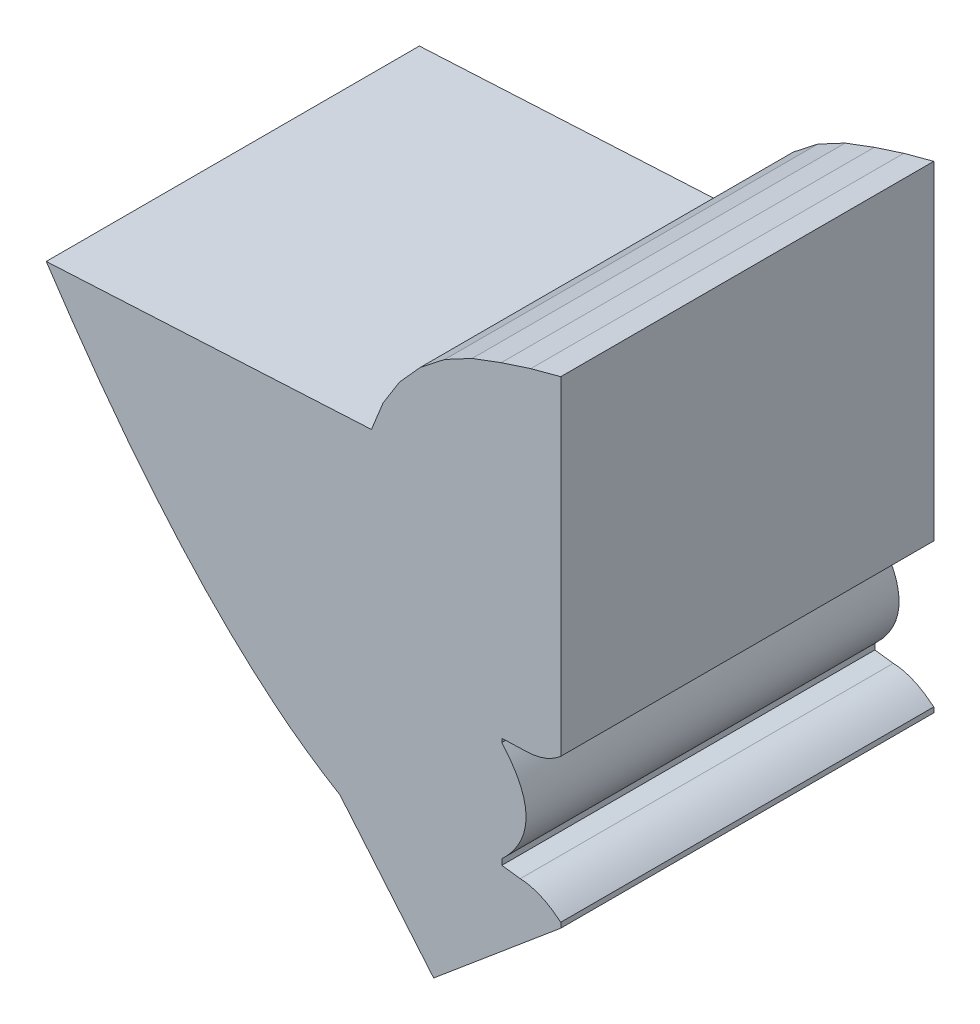
ISO-10303-21;
HEADER;
FILE_DESCRIPTION(('STEP AP214'),'2;1');
FILE_NAME('part.step','',(''),(''),'','','');
FILE_SCHEMA(('AUTOMOTIVE_DESIGN { 1 0 10303 214 1 1 1 1 }'));
ENDSEC;
DATA;
#1=APPLICATION_CONTEXT('core data for automotive mechanical design processes');
#2=APPLICATION_PROTOCOL_DEFINITION('international standard','automotive_design',2000,#1);
#3=PRODUCT_CONTEXT('',#1,'mechanical');
#4=PRODUCT('Part','Part','',(#3));
#5=PRODUCT_RELATED_PRODUCT_CATEGORY('part','',(#4));
#6=PRODUCT_DEFINITION_FORMATION('','',#4);
#7=PRODUCT_DEFINITION_CONTEXT('part definition',#1,'design');
#8=PRODUCT_DEFINITION('design','',#6,#7);
#9=PRODUCT_DEFINITION_SHAPE('','',#8);
#10=(LENGTH_UNIT() NAMED_UNIT(*) SI_UNIT(.MILLI.,.METRE.));
#11=(NAMED_UNIT(*) PLANE_ANGLE_UNIT() SI_UNIT($,.RADIAN.));
#12=(NAMED_UNIT(*) SI_UNIT($,.STERADIAN.) SOLID_ANGLE_UNIT());
#13=UNCERTAINTY_MEASURE_WITH_UNIT(LENGTH_MEASURE(1.E-05),#10,'distance_accuracy_value','');
#14=(GEOMETRIC_REPRESENTATION_CONTEXT(3) GLOBAL_UNCERTAINTY_ASSIGNED_CONTEXT((#13)) GLOBAL_UNIT_ASSIGNED_CONTEXT((#10,
#11,#12)) REPRESENTATION_CONTEXT('',''));
#15=CARTESIAN_POINT('',(0.,0.,0.));
#16=DIRECTION('',(0.,0.,1.));
#17=DIRECTION('',(1.,0.,0.));
#18=AXIS2_PLACEMENT_3D('',#15,#16,#17);
#19=CARTESIAN_POINT('',(-2.17733041778456,0.,7.21));
#20=DIRECTION('',(1.,0.,0.));
#21=DIRECTION('',(0.,1.,0.));
#22=AXIS2_PLACEMENT_3D('',#19,#20,#21);
#23=PLANE('',#22);
#24=DIRECTION('',(0.,1.,0.));
#25=VECTOR('',#24,1.);
#26=CARTESIAN_POINT('',(-2.17733041778456,0.,7.21));
#27=LINE('',#26,#25);
#28=CARTESIAN_POINT('',(-2.17733041779455,-1.68817652024789,7.21));
#29=VERTEX_POINT('',#28);
#30=CARTESIAN_POINT('',(-2.17733041778456,-1.91040609898522,7.21));
#31=VERTEX_POINT('',#30);
#32=EDGE_CURVE('E555',#29,#31,#27,.F.);
#33=ORIENTED_EDGE('',*,*,#32,.T.);
#34=DIRECTION('',(0.,0.,-1.));
#35=VECTOR('',#34,1.);
#36=CARTESIAN_POINT('',(-2.17733041778456,-1.91040609898522,7.21));
#37=LINE('',#36,#35);
#38=CARTESIAN_POINT('',(-2.17733041778456,-1.91040609898522,-7.21));
#39=VERTEX_POINT('',#38);
#40=EDGE_CURVE('E13',#31,#39,#37,.T.);
#41=ORIENTED_EDGE('',*,*,#40,.T.);
#42=DIRECTION('',(0.,1.,0.));
#43=VECTOR('',#42,1.);
#44=CARTESIAN_POINT('',(-2.17733041778456,0.,-7.21));
#45=LINE('',#44,#43);
#46=CARTESIAN_POINT('',(-2.17733041778456,-1.68817652020115,-7.21));
#47=VERTEX_POINT('',#46);
#48=EDGE_CURVE('E224',#47,#39,#45,.F.);
#49=ORIENTED_EDGE('',*,*,#48,.F.);
#50=DIRECTION('',(0.,0.,-1.));
#51=VECTOR('',#50,1.);
#52=CARTESIAN_POINT('',(-2.17733041778328,-1.68817652023794,30.8299178698776));
#53=LINE('',#52,#51);
#54=EDGE_CURVE('E592',#29,#47,#53,.T.);
#55=ORIENTED_EDGE('',*,*,#54,.F.);
#56=EDGE_LOOP('',(#33,#41,#49,#55));
#57=FACE_BOUND('',#56,.T.);
#58=ADVANCED_FACE('F59',(#57),#23,.T.);
#59=CARTESIAN_POINT('',(-82931.1005830976,996560.072871644,30.8299178698776));
#60=CARTESIAN_POINT('',(87153.8887538027,-996199.093812144,30.8299178698776));
#61=CARTESIAN_POINT('',(-91384.0928999308,995820.531871049,30.8299178698776));
#62=B_SPLINE_CURVE_WITH_KNOTS('',2,(#59,#60,#61),.UNSPECIFIED.,.F.,.F.,(3,3),(0.,1.),.UNSPECIFIED.);
#63=DIRECTION('',(0.,0.,-1.));
#64=VECTOR('',#63,1.);
#65=SURFACE_OF_LINEAR_EXTRUSION('',#62,#64);
#66=CARTESIAN_POINT('',(-10.3360060158837,-1.39847805225928,-7.21));
#67=CARTESIAN_POINT('',(-9.37885636254402,-2.12755150597659,-7.21));
#68=CARTESIAN_POINT('',(-8.43704683190594,-2.68128655488409,-7.21));
#69=B_SPLINE_CURVE_WITH_KNOTS('',2,(#66,#67,#68),.UNSPECIFIED.,.F.,.F.,(3,3),(0.500755258362618,
0.500965025000237),.UNSPECIFIED.);
#70=CARTESIAN_POINT('',(-10.3360060158632,-1.39847805228234,-7.2125366176972));
#71=VERTEX_POINT('',#70);
#72=CARTESIAN_POINT('',(-8.43704682943357,-2.68128655554208,-7.21));
#73=VERTEX_POINT('',#72);
#74=EDGE_CURVE('E551',#71,#73,#69,.T.);
#75=ORIENTED_EDGE('',*,*,#74,.T.);
#76=DIRECTION('',(0.,0.,-1.));
#77=VECTOR('',#76,1.);
#78=CARTESIAN_POINT('',(-8.43704682809343,-2.68128655714117,0.));
#79=LINE('',#78,#77);
#80=CARTESIAN_POINT('',(-8.43704683203825,-2.68128655481964,7.21));
#81=VERTEX_POINT('',#80);
#82=EDGE_CURVE('E65',#73,#81,#79,.F.);
#83=ORIENTED_EDGE('',*,*,#82,.T.);
#84=CARTESIAN_POINT('',(-8.43704683203184,-2.68128655480637,7.21));
#85=CARTESIAN_POINT('',(-9.37885636260762,-2.1275515059246,7.21));
#86=CARTESIAN_POINT('',(-10.3360060158829,-1.39847805225658,7.21));
#87=B_SPLINE_CURVE_WITH_KNOTS('',2,(#84,#85,#86),.UNSPECIFIED.,.F.,.F.,(3,3),(0.500755258362632,
0.500965025000236),.UNSPECIFIED.);
#88=CARTESIAN_POINT('',(-10.3360060158816,-1.39847805227263,7.21251805157951));
#89=VERTEX_POINT('',#88);
#90=EDGE_CURVE('E524',#89,#81,#87,.F.);
#91=ORIENTED_EDGE('',*,*,#90,.F.);
#92=CARTESIAN_POINT('',(-10.336006015861,-1.39847805228632,7.21));
#93=CARTESIAN_POINT('',(-10.6228848167366,-1.17995870432205,7.21));
#94=CARTESIAN_POINT('',(-10.9111416710362,-0.945688133646021,7.21));
#95=B_SPLINE_CURVE_WITH_KNOTS('',2,(#92,#93,#94),.UNSPECIFIED.,.F.,.F.,(3,3),(0.500965025000234,
0.501027896674745),.UNSPECIFIED.);
#96=CARTESIAN_POINT('',(-10.9111416711035,-0.945688133586594,7.21251805157951));
#97=VERTEX_POINT('',#96);
#98=EDGE_CURVE('E459',#97,#89,#95,.F.);
#99=ORIENTED_EDGE('',*,*,#98,.F.);
#100=CARTESIAN_POINT('',(-10.9111416711694,-0.945688133531575,7.21));
#101=CARTESIAN_POINT('',(-15.1971813204195,2.53763911301365,7.21));
#102=CARTESIAN_POINT('',(-19.7878835648669,9.50327575735757,7.21));
#103=B_SPLINE_CURVE_WITH_KNOTS('',2,(#100,#101,#102),.UNSPECIFIED.,.F.,.F.,(3,3),
(0.501027896674761,0.501962724366634),.UNSPECIFIED.);
#104=CARTESIAN_POINT('',(-19.7878835648708,9.50327575735899,7.21251805157951));
#105=VERTEX_POINT('',#104);
#106=EDGE_CURVE('E514',#105,#97,#103,.F.);
#107=ORIENTED_EDGE('',*,*,#106,.F.);
#108=DIRECTION('',(0.,0.,1.));
#109=VECTOR('',#108,1.);
#110=CARTESIAN_POINT('',(-19.7878835648708,9.50327575735899,-7.21507323539439));
#111=LINE('',#110,#109);
#112=CARTESIAN_POINT('',(-19.7878835648708,9.50327575735899,-7.21253661769719));
#113=VERTEX_POINT('',#112);
#114=EDGE_CURVE('E361',#113,#105,#111,.T.);
#115=ORIENTED_EDGE('',*,*,#114,.F.);
#116=CARTESIAN_POINT('',(-19.7878835648714,9.50327575734023,-7.21));
#117=CARTESIAN_POINT('',(-15.197181319061,2.53763911092818,-7.21));
#118=CARTESIAN_POINT('',(-10.9111416686287,-0.945688135617351,-7.21));
#119=B_SPLINE_CURVE_WITH_KNOTS('',2,(#116,#117,#118),.UNSPECIFIED.,.F.,.F.,(3,3),
(0.501027896674483,0.501962724366634),.UNSPECIFIED.);
#120=CARTESIAN_POINT('',(-10.9111416684846,-0.945688135711886,-7.21253661769719));
#121=VERTEX_POINT('',#120);
#122=EDGE_CURVE('E501',#113,#121,#119,.T.);
#123=ORIENTED_EDGE('',*,*,#122,.T.);
#124=CARTESIAN_POINT('',(-10.9111416684921,-0.945688135713634,-7.21));
#125=CARTESIAN_POINT('',(-10.6228848154707,-1.17995870528634,-7.21));
#126=CARTESIAN_POINT('',(-10.336006015861,-1.39847805228632,-7.21));
#127=B_SPLINE_CURVE_WITH_KNOTS('',2,(#124,#125,#126),.UNSPECIFIED.,.F.,.F.,(3,3),
(0.500965025000234,0.501027896674468),.UNSPECIFIED.);
#128=EDGE_CURVE('E447',#121,#71,#127,.T.);
#129=ORIENTED_EDGE('',*,*,#128,.T.);
#130=EDGE_LOOP('',(#75,#83,#91,#99,#107,#115,#123,#129));
#131=FACE_BOUND('',#130,.T.);
#132=ADVANCED_FACE('F419',(#131),#65,.T.);
#133=DIRECTION('',(0.,1.,0.));
#134=VECTOR('',#133,1.);
#135=CARTESIAN_POINT('',(-2.17733041778456,0.,-7.21));
#136=LINE('',#135,#134);
#137=CARTESIAN_POINT('',(-2.17733041778456,2.34248700715526,-7.21));
#138=VERTEX_POINT('',#137);
#139=CARTESIAN_POINT('',(-2.17733041777607,2.20172974209443,-7.21));
#140=VERTEX_POINT('',#139);
#141=EDGE_CURVE('E539',#138,#140,#136,.F.);
#142=ORIENTED_EDGE('',*,*,#141,.F.);
#143=DIRECTION('',(0.,0.,-1.));
#144=VECTOR('',#143,1.);
#145=CARTESIAN_POINT('',(-2.17733041778456,2.34248700715526,24.0565253000013));
#146=LINE('',#145,#144);
#147=CARTESIAN_POINT('',(-2.17733041778456,2.34248700715526,7.21));
#148=VERTEX_POINT('',#147);
#149=EDGE_CURVE('E355',#148,#138,#146,.T.);
#150=ORIENTED_EDGE('',*,*,#149,.F.);
#151=DIRECTION('',(0.,1.,0.));
#152=VECTOR('',#151,1.);
#153=CARTESIAN_POINT('',(-2.17733041778456,0.,7.21));
#154=LINE('',#153,#152);
#155=CARTESIAN_POINT('',(-2.17733041778074,2.20172974210003,7.21));
#156=VERTEX_POINT('',#155);
#157=EDGE_CURVE('E547',#148,#156,#154,.F.);
#158=ORIENTED_EDGE('',*,*,#157,.T.);
#159=DIRECTION('',(0.,0.,-1.));
#160=VECTOR('',#159,1.);
#161=CARTESIAN_POINT('',(-2.17733041778074,2.20172974210003,30.8299178698776));
#162=LINE('',#161,#160);
#163=EDGE_CURVE('E647',#156,#140,#162,.T.);
#164=ORIENTED_EDGE('',*,*,#163,.T.);
#165=EDGE_LOOP('',(#142,#150,#158,#164));
#166=FACE_BOUND('',#165,.T.);
#167=ADVANCED_FACE('F423',(#166),#23,.T.);
#168=CARTESIAN_POINT('',(0.,0.,7.21));
#169=DIRECTION('',(0.,0.,1.));
#170=DIRECTION('',(1.,0.,0.));
#171=AXIS2_PLACEMENT_3D('',#168,#169,#170);
#172=PLANE('',#171);
#173=ORIENTED_EDGE('',*,*,#90,.T.);
#174=DIRECTION('',(0.64278760968655,-0.766044443118969,0.));
#175=VECTOR('',#174,1.);
#176=CARTESIAN_POINT('',(-9.90823895971723,-0.927988048880237,7.21));
#177=LINE('',#176,#175);
#178=CARTESIAN_POINT('',(-4.81321597102845,-7.,7.21));
#179=VERTEX_POINT('',#178);
#180=EDGE_CURVE('E75',#81,#179,#177,.T.);
#181=ORIENTED_EDGE('',*,*,#180,.T.);
#182=DIRECTION('',(0.766044443118981,0.642787609686537,0.));
#183=VECTOR('',#182,1.);
#184=CARTESIAN_POINT('',(0.100000000004221,-2.87732229081219,7.21));
#185=LINE('',#184,#183);
#186=CARTESIAN_POINT('',(0.100000000004221,-2.87732229081219,7.21));
#187=VERTEX_POINT('',#186);
#188=EDGE_CURVE('E250',#179,#187,#185,.T.);
#189=ORIENTED_EDGE('',*,*,#188,.T.);
#190=DIRECTION('',(-1.45337301221682E-12,1.,0.));
#191=VECTOR('',#190,1.);
#192=CARTESIAN_POINT('',(0.10000000000393,-2.67732229081219,7.21));
#193=LINE('',#192,#191);
#194=CARTESIAN_POINT('',(0.10000000000393,-2.67732229081219,7.21));
#195=VERTEX_POINT('',#194);
#196=EDGE_CURVE('E601',#187,#195,#193,.T.);
#197=ORIENTED_EDGE('',*,*,#196,.T.);
#198=CARTESIAN_POINT('',(-15454.2110469643,-999884.599969266,7.21));
#199=CARTESIAN_POINT('',(17450.9064372771,999845.695156391,7.21));
#200=CARTESIAN_POINT('',(-19453.6018275899,-999814.790343517,7.21));
#201=B_SPLINE_CURVE_WITH_KNOTS('',2,(#198,#199,#200),.UNSPECIFIED.,.F.,.F.,(3,3),(0.,1.),.UNSPECIFIED.);
#202=CARTESIAN_POINT('',(-1.46510050451637,-2.00091389878962,7.21));
#203=VERTEX_POINT('',#202);
#204=EDGE_CURVE('E598',#195,#203,#201,.T.);
#205=ORIENTED_EDGE('',*,*,#204,.T.);
#206=DIRECTION('',(-0.99202225337885,0.126062876379801,0.));
#207=VECTOR('',#206,1.);
#208=CARTESIAN_POINT('',(-1.46510050451637,-2.00091389878962,7.21));
#209=LINE('',#208,#207);
#210=EDGE_CURVE('E230',#203,#31,#209,.T.);
#211=ORIENTED_EDGE('',*,*,#210,.T.);
#212=ORIENTED_EDGE('',*,*,#32,.F.);
#213=CARTESIAN_POINT('',(-2.17733041777607,2.20172974209443,7.21));
#214=CARTESIAN_POINT('',(-0.307419303310444,0.0931805865995528,7.21));
#215=CARTESIAN_POINT('',(-2.17733041779435,-1.68817652026,7.21));
#216=B_SPLINE_CURVE_WITH_KNOTS('',2,(#213,#214,#215),.UNSPECIFIED.,.F.,.F.,(3,3),
(0.49947186766891,0.500440643667569),.UNSPECIFIED.);
#217=EDGE_CURVE('E597',#156,#29,#216,.T.);
#218=ORIENTED_EDGE('',*,*,#217,.F.);
#219=ORIENTED_EDGE('',*,*,#157,.F.);
#220=DIRECTION('',(0.999390827019096,0.0348994967025048,0.));
#221=VECTOR('',#220,1.);
#222=CARTESIAN_POINT('',(-2.17733041778456,2.34248700715526,7.21));
#223=LINE('',#222,#221);
#224=CARTESIAN_POINT('',(-1.19050164048462,2.37694782742692,7.21000000000002));
#225=VERTEX_POINT('',#224);
#226=EDGE_CURVE('E78',#148,#225,#223,.T.);
#227=ORIENTED_EDGE('',*,*,#226,.T.);
#228=CARTESIAN_POINT('',(-343900.072311573,939011.080499257,7.21000000000001));
#229=CARTESIAN_POINT('',(342019.599581338,-939690.120785908,7.21000000000001));
#230=CARTESIAN_POINT('',(-340141.301828429,940379.16107256,7.21000000000001));
#231=B_SPLINE_CURVE_WITH_KNOTS('',2,(#228,#229,#230),.UNSPECIFIED.,.F.,.F.,(3,3),(0.,1.),.UNSPECIFIED.);
#232=CARTESIAN_POINT('',(0.100000000004221,2.87767341815847,7.21000000000001));
#233=VERTEX_POINT('',#232);
#234=EDGE_CURVE('E296',#225,#233,#231,.T.);
#235=ORIENTED_EDGE('',*,*,#234,.T.);
#236=DIRECTION('',(0.,1.,0.));
#237=VECTOR('',#236,1.);
#238=CARTESIAN_POINT('',(0.100000000004221,2.87767341815847,7.21));
#239=LINE('',#238,#237);
#240=CARTESIAN_POINT('',(0.100000000004747,15.587903347272,7.21));
#241=VERTEX_POINT('',#240);
#242=EDGE_CURVE('E335',#233,#241,#239,.T.);
#243=ORIENTED_EDGE('',*,*,#242,.T.);
#244=DIRECTION('',(-0.96592582628907,-0.258819045102515,0.));
#245=VECTOR('',#244,1.);
#246=CARTESIAN_POINT('',(-1.05911099154214,15.277320493149,7.21));
#247=LINE('',#246,#245);
#248=CARTESIAN_POINT('',(-1.05911099154214,15.277320493149,7.21000000000001));
#249=VERTEX_POINT('',#248);
#250=EDGE_CURVE('E329',#241,#249,#247,.T.);
#251=ORIENTED_EDGE('',*,*,#250,.T.);
#252=DIRECTION('',(-0.951056516295155,-0.309016994374943,0.));
#253=VECTOR('',#252,1.);
#254=CARTESIAN_POINT('',(-2.20037881109632,14.906500099899,7.21));
#255=LINE('',#254,#253);
#256=CARTESIAN_POINT('',(-2.20037881109632,14.906500099899,7.21000000000001));
#257=VERTEX_POINT('',#256);
#258=EDGE_CURVE('E328',#249,#257,#255,.T.);
#259=ORIENTED_EDGE('',*,*,#258,.T.);
#260=DIRECTION('',(-0.9366721892484,-0.350207381259461,0.));
#261=VECTOR('',#260,1.);
#262=CARTESIAN_POINT('',(-3.3243854381944,14.4862512423877,7.21));
#263=LINE('',#262,#261);
#264=CARTESIAN_POINT('',(-3.3243854381944,14.4862512423877,7.21000000000001));
#265=VERTEX_POINT('',#264);
#266=EDGE_CURVE('E324',#257,#265,#263,.T.);
#267=ORIENTED_EDGE('',*,*,#266,.T.);
#268=DIRECTION('',(-0.882947592859007,-0.46947156278574,0.));
#269=VECTOR('',#268,1.);
#270=CARTESIAN_POINT('',(-4.38392254962521,13.9228853670448,7.21));
#271=LINE('',#270,#269);
#272=CARTESIAN_POINT('',(-4.38392254962521,13.9228853670448,7.21000000000001));
#273=VERTEX_POINT('',#272);
#274=EDGE_CURVE('E318',#265,#273,#271,.T.);
#275=ORIENTED_EDGE('',*,*,#274,.T.);
#276=DIRECTION('',(-0.788010753606726,-0.615661475325654,0.));
#277=VECTOR('',#276,1.);
#278=CARTESIAN_POINT('',(-5.32953545395328,13.184091596654,7.21));
#279=LINE('',#278,#277);
#280=CARTESIAN_POINT('',(-5.32953545395328,13.184091596654,7.21000000000001));
#281=VERTEX_POINT('',#280);
#282=EDGE_CURVE('E320',#273,#281,#279,.T.);
#283=ORIENTED_EDGE('',*,*,#282,.T.);
#284=DIRECTION('',(-0.669130606358526,-0.743144825477694,0.));
#285=VECTOR('',#284,1.);
#286=CARTESIAN_POINT('',(-6.13249218158351,12.2923178060808,7.21));
#287=LINE('',#286,#285);
#288=CARTESIAN_POINT('',(-6.13249218158351,12.2923178060808,7.21000000000001));
#289=VERTEX_POINT('',#288);
#290=EDGE_CURVE('E313',#281,#289,#287,.T.);
#291=ORIENTED_EDGE('',*,*,#290,.T.);
#292=DIRECTION('',(-0.52991926423321,-0.848048096156423,0.));
#293=VECTOR('',#292,1.);
#294=CARTESIAN_POINT('',(-6.76839529866336,11.2746600906931,7.21));
#295=LINE('',#294,#293);
#296=CARTESIAN_POINT('',(-6.76839529866336,11.2746600906931,7.21000000000001));
#297=VERTEX_POINT('',#296);
#298=EDGE_CURVE('E311',#289,#297,#295,.T.);
#299=ORIENTED_EDGE('',*,*,#298,.T.);
#300=DIRECTION('',(-0.374606593415918,-0.927183854566785,0.));
#301=VECTOR('',#300,1.);
#302=CARTESIAN_POINT('',(-7.21792321076246,10.1620394652129,7.21));
#303=LINE('',#302,#301);
#304=CARTESIAN_POINT('',(-7.21792321076246,10.1620394652129,7.21000000000001));
#305=VERTEX_POINT('',#304);
#306=EDGE_CURVE('E308',#297,#305,#303,.T.);
#307=ORIENTED_EDGE('',*,*,#306,.T.);
#308=DIRECTION('',(-0.998629534754494,-0.0523359562444688,0.));
#309=VECTOR('',#308,1.);
#310=CARTESIAN_POINT('',(-10.3098203952063,10.,7.21));
#311=LINE('',#310,#309);
#312=EDGE_CURVE('E303',#305,#105,#311,.T.);
#313=ORIENTED_EDGE('',*,*,#312,.T.);
#314=ORIENTED_EDGE('',*,*,#106,.T.);
#315=ORIENTED_EDGE('',*,*,#98,.T.);
#316=EDGE_LOOP('',(#173,#181,#189,#197,#205,#211,#212,#218,#219,#227,#235,#243,#251,#259,#267,
#275,#283,#291,#299,#307,#313,#314,#315));
#317=FACE_BOUND('',#316,.T.);
#318=ADVANCED_FACE('F484',(#317),#172,.T.);
#319=CARTESIAN_POINT('',(0.,0.,-7.21));
#320=DIRECTION('',(0.,0.,1.));
#321=DIRECTION('',(1.,0.,0.));
#322=AXIS2_PLACEMENT_3D('',#319,#320,#321);
#323=PLANE('',#322);
#324=ORIENTED_EDGE('',*,*,#48,.T.);
#325=DIRECTION('',(0.99202225337885,-0.126062876379801,0.));
#326=VECTOR('',#325,1.);
#327=CARTESIAN_POINT('',(-1.46510050451637,-2.00091389878962,-7.21));
#328=LINE('',#327,#326);
#329=CARTESIAN_POINT('',(-1.46510050451637,-2.00091389878962,-7.21));
#330=VERTEX_POINT('',#329);
#331=EDGE_CURVE('E214',#39,#330,#328,.T.);
#332=ORIENTED_EDGE('',*,*,#331,.T.);
#333=CARTESIAN_POINT('',(-15454.2110469643,-999884.599969266,-7.21));
#334=CARTESIAN_POINT('',(17450.9064372771,999845.695156391,-7.21));
#335=CARTESIAN_POINT('',(-19453.6018275899,-999814.790343517,-7.21));
#336=B_SPLINE_CURVE_WITH_KNOTS('',2,(#333,#334,#335),.UNSPECIFIED.,.F.,.F.,(3,3),(0.,1.),.UNSPECIFIED.);
#337=CARTESIAN_POINT('',(0.10000000000393,-2.67732229081219,-7.21));
#338=VERTEX_POINT('',#337);
#339=EDGE_CURVE('E216',#330,#338,#336,.F.);
#340=ORIENTED_EDGE('',*,*,#339,.T.);
#341=DIRECTION('',(1.45337301221682E-12,-1.,0.));
#342=VECTOR('',#341,1.);
#343=CARTESIAN_POINT('',(0.10000000000393,-2.67732229081219,-7.21));
#344=LINE('',#343,#342);
#345=CARTESIAN_POINT('',(0.100000000004221,-2.87732229081219,-7.21));
#346=VERTEX_POINT('',#345);
#347=EDGE_CURVE('E236',#338,#346,#344,.T.);
#348=ORIENTED_EDGE('',*,*,#347,.T.);
#349=DIRECTION('',(-0.766044443118981,-0.642787609686537,0.));
#350=VECTOR('',#349,1.);
#351=CARTESIAN_POINT('',(0.100000000004221,-2.87732229081219,-7.21));
#352=LINE('',#351,#350);
#353=CARTESIAN_POINT('',(-4.81321597102846,-7.,-7.21));
#354=VERTEX_POINT('',#353);
#355=EDGE_CURVE('E238',#346,#354,#352,.T.);
#356=ORIENTED_EDGE('',*,*,#355,.T.);
#357=DIRECTION('',(-0.64278760968655,0.766044443118969,0.));
#358=VECTOR('',#357,1.);
#359=CARTESIAN_POINT('',(-9.90823895971723,-0.927988048880237,-7.21));
#360=LINE('',#359,#358);
#361=EDGE_CURVE('E257',#354,#73,#360,.T.);
#362=ORIENTED_EDGE('',*,*,#361,.T.);
#363=ORIENTED_EDGE('',*,*,#74,.F.);
#364=ORIENTED_EDGE('',*,*,#128,.F.);
#365=ORIENTED_EDGE('',*,*,#122,.F.);
#366=DIRECTION('',(-0.998629534754494,-0.0523359562444688,0.));
#367=VECTOR('',#366,1.);
#368=CARTESIAN_POINT('',(-0.550881453784725,10.5114443180936,-7.21));
#369=LINE('',#368,#367);
#370=CARTESIAN_POINT('',(-7.21792321076246,10.1620394652129,-7.21));
#371=VERTEX_POINT('',#370);
#372=EDGE_CURVE('E527',#371,#113,#369,.T.);
#373=ORIENTED_EDGE('',*,*,#372,.F.);
#374=DIRECTION('',(0.374606593415918,0.927183854566785,0.));
#375=VECTOR('',#374,1.);
#376=CARTESIAN_POINT('',(-7.21792321076246,10.1620394652129,-7.21));
#377=LINE('',#376,#375);
#378=CARTESIAN_POINT('',(-6.76839529866336,11.2746600906931,-7.21));
#379=VERTEX_POINT('',#378);
#380=EDGE_CURVE('E274',#371,#379,#377,.T.);
#381=ORIENTED_EDGE('',*,*,#380,.T.);
#382=DIRECTION('',(0.52991926423321,0.848048096156423,0.));
#383=VECTOR('',#382,1.);
#384=CARTESIAN_POINT('',(-6.76839529866336,11.2746600906931,-7.21));
#385=LINE('',#384,#383);
#386=CARTESIAN_POINT('',(-6.13249218158351,12.2923178060808,-7.21));
#387=VERTEX_POINT('',#386);
#388=EDGE_CURVE('E272',#379,#387,#385,.T.);
#389=ORIENTED_EDGE('',*,*,#388,.T.);
#390=DIRECTION('',(0.669130606358526,0.743144825477694,0.));
#391=VECTOR('',#390,1.);
#392=CARTESIAN_POINT('',(-6.13249218158351,12.2923178060808,-7.21));
#393=LINE('',#392,#391);
#394=CARTESIAN_POINT('',(-5.32953545395328,13.184091596654,-7.21));
#395=VERTEX_POINT('',#394);
#396=EDGE_CURVE('E267',#387,#395,#393,.T.);
#397=ORIENTED_EDGE('',*,*,#396,.T.);
#398=DIRECTION('',(0.788010753606726,0.615661475325654,0.));
#399=VECTOR('',#398,1.);
#400=CARTESIAN_POINT('',(-5.32953545395328,13.184091596654,-7.21));
#401=LINE('',#400,#399);
#402=CARTESIAN_POINT('',(-4.38392254962521,13.9228853670448,-7.21));
#403=VERTEX_POINT('',#402);
#404=EDGE_CURVE('E262',#395,#403,#401,.T.);
#405=ORIENTED_EDGE('',*,*,#404,.T.);
#406=DIRECTION('',(0.882947592859007,0.46947156278574,0.));
#407=VECTOR('',#406,1.);
#408=CARTESIAN_POINT('',(-4.38392254962521,13.9228853670448,-7.21));
#409=LINE('',#408,#407);
#410=CARTESIAN_POINT('',(-3.3243854381944,14.4862512423877,-7.21));
#411=VERTEX_POINT('',#410);
#412=EDGE_CURVE('E265',#403,#411,#409,.T.);
#413=ORIENTED_EDGE('',*,*,#412,.T.);
#414=DIRECTION('',(0.9366721892484,0.350207381259461,0.));
#415=VECTOR('',#414,1.);
#416=CARTESIAN_POINT('',(-3.3243854381944,14.4862512423877,-7.21));
#417=LINE('',#416,#415);
#418=CARTESIAN_POINT('',(-2.20037881109632,14.906500099899,-7.21000000000001));
#419=VERTEX_POINT('',#418);
#420=EDGE_CURVE('E249',#411,#419,#417,.T.);
#421=ORIENTED_EDGE('',*,*,#420,.T.);
#422=DIRECTION('',(0.951056516295155,0.309016994374943,0.));
#423=VECTOR('',#422,1.);
#424=CARTESIAN_POINT('',(-2.20037881109632,14.906500099899,-7.21));
#425=LINE('',#424,#423);
#426=CARTESIAN_POINT('',(-1.05911099154214,15.277320493149,-7.21));
#427=VERTEX_POINT('',#426);
#428=EDGE_CURVE('E295',#419,#427,#425,.T.);
#429=ORIENTED_EDGE('',*,*,#428,.T.);
#430=DIRECTION('',(0.96592582628907,0.258819045102515,0.));
#431=VECTOR('',#430,1.);
#432=CARTESIAN_POINT('',(-1.05911099154214,15.277320493149,-7.21));
#433=LINE('',#432,#431);
#434=CARTESIAN_POINT('',(0.100000000004747,15.587903347272,-7.21));
#435=VERTEX_POINT('',#434);
#436=EDGE_CURVE('E293',#427,#435,#433,.T.);
#437=ORIENTED_EDGE('',*,*,#436,.T.);
#438=DIRECTION('',(0.,-1.,0.));
#439=VECTOR('',#438,1.);
#440=CARTESIAN_POINT('',(0.100000000004221,2.87767341815847,-7.21));
#441=LINE('',#440,#439);
#442=CARTESIAN_POINT('',(0.0999999999995449,2.8776734181557,-7.21000000000001));
#443=VERTEX_POINT('',#442);
#444=EDGE_CURVE('E282',#435,#443,#441,.T.);
#445=ORIENTED_EDGE('',*,*,#444,.T.);
#446=CARTESIAN_POINT('',(-343900.072311573,939011.080499257,-7.21000000000001));
#447=CARTESIAN_POINT('',(342019.599581338,-939690.120785908,-7.21000000000001));
#448=CARTESIAN_POINT('',(-340141.301828429,940379.16107256,-7.21000000000001));
#449=B_SPLINE_CURVE_WITH_KNOTS('',2,(#446,#447,#448),.UNSPECIFIED.,.F.,.F.,(3,3),(0.,1.),.UNSPECIFIED.);
#450=CARTESIAN_POINT('',(-1.19050164048462,2.37694782741517,-7.21));
#451=VERTEX_POINT('',#450);
#452=EDGE_CURVE('E280',#443,#451,#449,.F.);
#453=ORIENTED_EDGE('',*,*,#452,.T.);
#454=DIRECTION('',(-0.999390827019096,-0.0348994967025048,0.));
#455=VECTOR('',#454,1.);
#456=CARTESIAN_POINT('',(-2.17733041778456,2.34248700715526,-7.21));
#457=LINE('',#456,#455);
#458=EDGE_CURVE('E277',#451,#138,#457,.T.);
#459=ORIENTED_EDGE('',*,*,#458,.T.);
#460=ORIENTED_EDGE('',*,*,#141,.T.);
#461=CARTESIAN_POINT('',(-2.17733041776379,-1.68817652023098,-7.21));
#462=CARTESIAN_POINT('',(-0.307419303328964,0.0931805866132554,-7.21));
#463=CARTESIAN_POINT('',(-2.17733041776824,2.20172974208621,-7.21));
#464=B_SPLINE_CURVE_WITH_KNOTS('',2,(#461,#462,#463),.UNSPECIFIED.,.F.,.F.,(3,3),
(0.499471867668912,0.500440643667561),.UNSPECIFIED.);
#465=EDGE_CURVE('E648',#47,#140,#464,.T.);
#466=ORIENTED_EDGE('',*,*,#465,.F.);
#467=EDGE_LOOP('',(#324,#332,#340,#348,#356,#362,#363,#364,#365,#373,#381,#389,#397,#405,#413,
#421,#429,#437,#445,#453,#459,#460,#466));
#468=FACE_BOUND('',#467,.T.);
#469=ADVANCED_FACE('F215',(#468),#323,.F.);
#470=CARTESIAN_POINT('',(-996021.636606251,89148.1321438377,30.8299178698776));
#471=CARTESIAN_POINT('',(996193.448091746,-87155.7427476542,30.8299178698776));
#472=CARTESIAN_POINT('',(-996370.259577241,85163.3533514707,30.8299178698776));
#473=B_SPLINE_CURVE_WITH_KNOTS('',2,(#470,#471,#472),.UNSPECIFIED.,.F.,.F.,(3,3),(0.,1.),.UNSPECIFIED.);
#474=DIRECTION('',(0.,0.,-1.));
#475=VECTOR('',#474,1.);
#476=SURFACE_OF_LINEAR_EXTRUSION('',#473,#475);
#477=ORIENTED_EDGE('',*,*,#163,.F.);
#478=ORIENTED_EDGE('',*,*,#217,.T.);
#479=ORIENTED_EDGE('',*,*,#54,.T.);
#480=ORIENTED_EDGE('',*,*,#465,.T.);
#481=EDGE_LOOP('',(#477,#478,#479,#480));
#482=FACE_BOUND('',#481,.T.);
#483=ADVANCED_FACE('F414',(#482),#476,.T.);
#484=CARTESIAN_POINT('',(-19.7878835648708,9.50327575735899,-7.21507323539439));
#485=DIRECTION('',(-0.0523359562444688,0.998629534754494,0.));
#486=DIRECTION('',(-0.998629534754494,-0.0523359562444688,0.));
#487=AXIS2_PLACEMENT_3D('',#484,#485,#486);
#488=PLANE('',#487);
#489=ORIENTED_EDGE('',*,*,#312,.F.);
#490=DIRECTION('',(0.,0.,-1.));
#491=VECTOR('',#490,1.);
#492=CARTESIAN_POINT('',(-7.21792321076246,10.1620394652129,24.0565253000013));
#493=LINE('',#492,#491);
#494=EDGE_CURVE('E347',#305,#371,#493,.T.);
#495=ORIENTED_EDGE('',*,*,#494,.T.);
#496=ORIENTED_EDGE('',*,*,#372,.T.);
#497=ORIENTED_EDGE('',*,*,#114,.T.);
#498=EDGE_LOOP('',(#489,#495,#496,#497));
#499=FACE_BOUND('',#498,.T.);
#500=ADVANCED_FACE('F410',(#499),#488,.T.);
#501=CARTESIAN_POINT('',(-1.05911099154214,15.277320493149,24.0565253000013));
#502=DIRECTION('',(0.258819045102515,-0.96592582628907,0.));
#503=DIRECTION('',(0.96592582628907,0.258819045102515,0.));
#504=AXIS2_PLACEMENT_3D('',#501,#502,#503);
#505=PLANE('',#504);
#506=ORIENTED_EDGE('',*,*,#250,.F.);
#507=DIRECTION('',(0.,0.,-1.));
#508=VECTOR('',#507,1.);
#509=CARTESIAN_POINT('',(0.100000000004747,15.587903347272,24.0565253000013));
#510=LINE('',#509,#508);
#511=EDGE_CURVE('E300',#241,#435,#510,.T.);
#512=ORIENTED_EDGE('',*,*,#511,.T.);
#513=ORIENTED_EDGE('',*,*,#436,.F.);
#514=DIRECTION('',(0.,0.,-1.));
#515=VECTOR('',#514,1.);
#516=CARTESIAN_POINT('',(-1.05911099154214,15.277320493149,24.0565253000013));
#517=LINE('',#516,#515);
#518=EDGE_CURVE('E337',#249,#427,#517,.T.);
#519=ORIENTED_EDGE('',*,*,#518,.F.);
#520=EDGE_LOOP('',(#506,#512,#513,#519));
#521=FACE_BOUND('',#520,.T.);
#522=ADVANCED_FACE('F406',(#521),#505,.F.);
#523=CARTESIAN_POINT('',(-2.20037881109632,14.906500099899,24.0565253000013));
#524=DIRECTION('',(0.309016994374943,-0.951056516295155,0.));
#525=DIRECTION('',(0.951056516295155,0.309016994374943,0.));
#526=AXIS2_PLACEMENT_3D('',#523,#524,#525);
#527=PLANE('',#526);
#528=ORIENTED_EDGE('',*,*,#258,.F.);
#529=ORIENTED_EDGE('',*,*,#518,.T.);
#530=ORIENTED_EDGE('',*,*,#428,.F.);
#531=DIRECTION('',(0.,0.,-1.));
#532=VECTOR('',#531,1.);
#533=CARTESIAN_POINT('',(-2.20037881109632,14.906500099899,24.0565253000013));
#534=LINE('',#533,#532);
#535=EDGE_CURVE('E336',#257,#419,#534,.T.);
#536=ORIENTED_EDGE('',*,*,#535,.F.);
#537=EDGE_LOOP('',(#528,#529,#530,#536));
#538=FACE_BOUND('',#537,.T.);
#539=ADVANCED_FACE('F405',(#538),#527,.F.);
#540=CARTESIAN_POINT('',(-3.3243854381944,14.4862512423877,24.0565253000013));
#541=DIRECTION('',(0.350207381259461,-0.9366721892484,0.));
#542=DIRECTION('',(0.9366721892484,0.350207381259461,0.));
#543=AXIS2_PLACEMENT_3D('',#540,#541,#542);
#544=PLANE('',#543);
#545=ORIENTED_EDGE('',*,*,#266,.F.);
#546=ORIENTED_EDGE('',*,*,#535,.T.);
#547=ORIENTED_EDGE('',*,*,#420,.F.);
#548=DIRECTION('',(0.,0.,-1.));
#549=VECTOR('',#548,1.);
#550=CARTESIAN_POINT('',(-3.3243854381944,14.4862512423877,24.0565253000013));
#551=LINE('',#550,#549);
#552=EDGE_CURVE('E338',#265,#411,#551,.T.);
#553=ORIENTED_EDGE('',*,*,#552,.F.);
#554=EDGE_LOOP('',(#545,#546,#547,#553));
#555=FACE_BOUND('',#554,.T.);
#556=ADVANCED_FACE('F397',(#555),#544,.F.);
#557=CARTESIAN_POINT('',(-4.38392254962521,13.9228853670448,24.0565253000013));
#558=DIRECTION('',(0.46947156278574,-0.882947592859007,0.));
#559=DIRECTION('',(0.882947592859007,0.46947156278574,0.));
#560=AXIS2_PLACEMENT_3D('',#557,#558,#559);
#561=PLANE('',#560);
#562=ORIENTED_EDGE('',*,*,#274,.F.);
#563=ORIENTED_EDGE('',*,*,#552,.T.);
#564=ORIENTED_EDGE('',*,*,#412,.F.);
#565=DIRECTION('',(0.,0.,-1.));
#566=VECTOR('',#565,1.);
#567=CARTESIAN_POINT('',(-4.38392254962521,13.9228853670448,24.0565253000013));
#568=LINE('',#567,#566);
#569=EDGE_CURVE('E342',#273,#403,#568,.T.);
#570=ORIENTED_EDGE('',*,*,#569,.F.);
#571=EDGE_LOOP('',(#562,#563,#564,#570));
#572=FACE_BOUND('',#571,.T.);
#573=ADVANCED_FACE('F394',(#572),#561,.F.);
#574=CARTESIAN_POINT('',(-5.32953545395328,13.184091596654,24.0565253000013));
#575=DIRECTION('',(0.615661475325654,-0.788010753606726,0.));
#576=DIRECTION('',(0.788010753606726,0.615661475325654,0.));
#577=AXIS2_PLACEMENT_3D('',#574,#575,#576);
#578=PLANE('',#577);
#579=ORIENTED_EDGE('',*,*,#282,.F.);
#580=ORIENTED_EDGE('',*,*,#569,.T.);
#581=ORIENTED_EDGE('',*,*,#404,.F.);
#582=DIRECTION('',(0.,0.,-1.));
#583=VECTOR('',#582,1.);
#584=CARTESIAN_POINT('',(-5.32953545395328,13.184091596654,24.0565253000013));
#585=LINE('',#584,#583);
#586=EDGE_CURVE('E343',#281,#395,#585,.T.);
#587=ORIENTED_EDGE('',*,*,#586,.F.);
#588=EDGE_LOOP('',(#579,#580,#581,#587));
#589=FACE_BOUND('',#588,.T.);
#590=ADVANCED_FACE('F390',(#589),#578,.F.);
#591=CARTESIAN_POINT('',(-6.13249218158351,12.2923178060808,24.0565253000013));
#592=DIRECTION('',(0.743144825477693,-0.669130606358526,0.));
#593=DIRECTION('',(0.669130606358526,0.743144825477694,0.));
#594=AXIS2_PLACEMENT_3D('',#591,#592,#593);
#595=PLANE('',#594);
#596=ORIENTED_EDGE('',*,*,#290,.F.);
#597=ORIENTED_EDGE('',*,*,#586,.T.);
#598=ORIENTED_EDGE('',*,*,#396,.F.);
#599=DIRECTION('',(0.,0.,-1.));
#600=VECTOR('',#599,1.);
#601=CARTESIAN_POINT('',(-6.13249218158351,12.2923178060808,24.0565253000013));
#602=LINE('',#601,#600);
#603=EDGE_CURVE('E348',#289,#387,#602,.T.);
#604=ORIENTED_EDGE('',*,*,#603,.F.);
#605=EDGE_LOOP('',(#596,#597,#598,#604));
#606=FACE_BOUND('',#605,.T.);
#607=ADVANCED_FACE('F386',(#606),#595,.F.);
#608=CARTESIAN_POINT('',(-6.76839529866336,11.2746600906931,24.0565253000013));
#609=DIRECTION('',(0.848048096156423,-0.52991926423321,0.));
#610=DIRECTION('',(0.52991926423321,0.848048096156423,0.));
#611=AXIS2_PLACEMENT_3D('',#608,#609,#610);
#612=PLANE('',#611);
#613=ORIENTED_EDGE('',*,*,#298,.F.);
#614=ORIENTED_EDGE('',*,*,#603,.T.);
#615=ORIENTED_EDGE('',*,*,#388,.F.);
#616=DIRECTION('',(0.,0.,-1.));
#617=VECTOR('',#616,1.);
#618=CARTESIAN_POINT('',(-6.76839529866336,11.2746600906931,24.0565253000013));
#619=LINE('',#618,#617);
#620=EDGE_CURVE('E346',#297,#379,#619,.T.);
#621=ORIENTED_EDGE('',*,*,#620,.F.);
#622=EDGE_LOOP('',(#613,#614,#615,#621));
#623=FACE_BOUND('',#622,.T.);
#624=ADVANCED_FACE('F385',(#623),#612,.F.);
#625=CARTESIAN_POINT('',(-7.21792321076246,10.1620394652129,24.0565253000013));
#626=DIRECTION('',(0.927183854566785,-0.374606593415918,0.));
#627=DIRECTION('',(0.374606593415918,0.927183854566785,0.));
#628=AXIS2_PLACEMENT_3D('',#625,#626,#627);
#629=PLANE('',#628);
#630=ORIENTED_EDGE('',*,*,#306,.F.);
#631=ORIENTED_EDGE('',*,*,#620,.T.);
#632=ORIENTED_EDGE('',*,*,#380,.F.);
#633=ORIENTED_EDGE('',*,*,#494,.F.);
#634=EDGE_LOOP('',(#630,#631,#632,#633));
#635=FACE_BOUND('',#634,.T.);
#636=ADVANCED_FACE('F378',(#635),#629,.F.);
#637=CARTESIAN_POINT('',(-2.17733041778456,2.34248700715526,24.0565253000013));
#638=DIRECTION('',(-0.0348994967025048,0.999390827019096,0.));
#639=DIRECTION('',(-0.999390827019096,-0.0348994967025048,0.));
#640=AXIS2_PLACEMENT_3D('',#637,#638,#639);
#641=PLANE('',#640);
#642=ORIENTED_EDGE('',*,*,#226,.F.);
#643=ORIENTED_EDGE('',*,*,#149,.T.);
#644=ORIENTED_EDGE('',*,*,#458,.F.);
#645=DIRECTION('',(0.,0.,-1.));
#646=VECTOR('',#645,1.);
#647=CARTESIAN_POINT('',(-1.19050164048462,2.37694782742692,24.0565253000013));
#648=LINE('',#647,#646);
#649=EDGE_CURVE('E352',#225,#451,#648,.T.);
#650=ORIENTED_EDGE('',*,*,#649,.F.);
#651=EDGE_LOOP('',(#642,#643,#644,#650));
#652=FACE_BOUND('',#651,.T.);
#653=ADVANCED_FACE('F372',(#652),#641,.F.);
#654=CARTESIAN_POINT('',(-343900.072311573,939011.080499257,24.0565253000013));
#655=CARTESIAN_POINT('',(342019.599581338,-939690.120785908,24.0565253000013));
#656=CARTESIAN_POINT('',(-340141.301828429,940379.16107256,24.0565253000013));
#657=B_SPLINE_CURVE_WITH_KNOTS('',2,(#654,#655,#656),.UNSPECIFIED.,.F.,.F.,(3,3),(0.,1.),.UNSPECIFIED.);
#658=DIRECTION('',(0.,0.,-1.));
#659=VECTOR('',#658,1.);
#660=SURFACE_OF_LINEAR_EXTRUSION('',#657,#659);
#661=ORIENTED_EDGE('',*,*,#234,.F.);
#662=ORIENTED_EDGE('',*,*,#649,.T.);
#663=ORIENTED_EDGE('',*,*,#452,.F.);
#664=DIRECTION('',(0.,0.,-1.));
#665=VECTOR('',#664,1.);
#666=CARTESIAN_POINT('',(0.100000000004221,2.87767341815847,24.0565253000013));
#667=LINE('',#666,#665);
#668=EDGE_CURVE('E334',#233,#443,#667,.T.);
#669=ORIENTED_EDGE('',*,*,#668,.F.);
#670=EDGE_LOOP('',(#661,#662,#663,#669));
#671=FACE_BOUND('',#670,.T.);
#672=ADVANCED_FACE('F367',(#671),#660,.F.);
#673=CARTESIAN_POINT('',(0.100000000004221,2.87767341815847,24.0565253000013));
#674=DIRECTION('',(-1.,0.,0.));
#675=DIRECTION('',(0.,-1.,0.));
#676=AXIS2_PLACEMENT_3D('',#673,#674,#675);
#677=PLANE('',#676);
#678=ORIENTED_EDGE('',*,*,#242,.F.);
#679=ORIENTED_EDGE('',*,*,#668,.T.);
#680=ORIENTED_EDGE('',*,*,#444,.F.);
#681=ORIENTED_EDGE('',*,*,#511,.F.);
#682=EDGE_LOOP('',(#678,#679,#680,#681));
#683=FACE_BOUND('',#682,.T.);
#684=ADVANCED_FACE('F373',(#683),#677,.F.);
#685=CARTESIAN_POINT('',(-15454.2110469643,-999884.599969266,18.9161597549962));
#686=CARTESIAN_POINT('',(17450.9064372771,999845.695156391,18.9161597549962));
#687=CARTESIAN_POINT('',(-19453.6018275899,-999814.790343517,18.9161597549962));
#688=B_SPLINE_CURVE_WITH_KNOTS('',2,(#685,#686,#687),.UNSPECIFIED.,.F.,.F.,(3,3),(0.,1.),.UNSPECIFIED.);
#689=DIRECTION('',(0.,0.,-1.));
#690=VECTOR('',#689,1.);
#691=SURFACE_OF_LINEAR_EXTRUSION('',#688,#690);
#692=ORIENTED_EDGE('',*,*,#204,.F.);
#693=DIRECTION('',(0.,0.,-1.));
#694=VECTOR('',#693,1.);
#695=CARTESIAN_POINT('',(0.10000000000393,-2.67732229081219,18.9161597549962));
#696=LINE('',#695,#694);
#697=EDGE_CURVE('E225',#195,#338,#696,.T.);
#698=ORIENTED_EDGE('',*,*,#697,.T.);
#699=ORIENTED_EDGE('',*,*,#339,.F.);
#700=DIRECTION('',(0.,0.,-1.));
#701=VECTOR('',#700,1.);
#702=CARTESIAN_POINT('',(-1.46510050451637,-2.00091389878962,18.9161597549962));
#703=LINE('',#702,#701);
#704=EDGE_CURVE('E228',#203,#330,#703,.T.);
#705=ORIENTED_EDGE('',*,*,#704,.F.);
#706=EDGE_LOOP('',(#692,#698,#699,#705));
#707=FACE_BOUND('',#706,.T.);
#708=ADVANCED_FACE('F232',(#707),#691,.F.);
#709=CARTESIAN_POINT('',(-1.46510050451637,-2.00091389878962,18.9161597549962));
#710=DIRECTION('',(-0.126062876379801,-0.99202225337885,0.));
#711=DIRECTION('',(0.99202225337885,-0.126062876379801,0.));
#712=AXIS2_PLACEMENT_3D('',#709,#710,#711);
#713=PLANE('',#712);
#714=ORIENTED_EDGE('',*,*,#40,.F.);
#715=ORIENTED_EDGE('',*,*,#210,.F.);
#716=ORIENTED_EDGE('',*,*,#704,.T.);
#717=ORIENTED_EDGE('',*,*,#331,.F.);
#718=EDGE_LOOP('',(#714,#715,#716,#717));
#719=FACE_BOUND('',#718,.T.);
#720=ADVANCED_FACE('F227',(#719),#713,.F.);
#721=CARTESIAN_POINT('',(-9.90823895971723,-0.927988048880237,18.9161597549962));
#722=DIRECTION('',(0.766044443118969,0.64278760968655,0.));
#723=DIRECTION('',(-0.64278760968655,0.766044443118969,0.));
#724=AXIS2_PLACEMENT_3D('',#721,#722,#723);
#725=PLANE('',#724);
#726=ORIENTED_EDGE('',*,*,#82,.F.);
#727=ORIENTED_EDGE('',*,*,#361,.F.);
#728=DIRECTION('',(0.,0.,-1.));
#729=VECTOR('',#728,1.);
#730=CARTESIAN_POINT('',(-4.81321597102845,-7.,18.9161597549962));
#731=LINE('',#730,#729);
#732=EDGE_CURVE('E231',#179,#354,#731,.T.);
#733=ORIENTED_EDGE('',*,*,#732,.F.);
#734=ORIENTED_EDGE('',*,*,#180,.F.);
#735=EDGE_LOOP('',(#726,#727,#733,#734));
#736=FACE_BOUND('',#735,.T.);
#737=ADVANCED_FACE('F625',(#736),#725,.F.);
#738=CARTESIAN_POINT('',(0.100000000004221,-2.87732229081219,18.9161597549962));
#739=DIRECTION('',(-0.642787609686536,0.76604444311898,0.));
#740=DIRECTION('',(-0.766044443118981,-0.642787609686537,0.));
#741=AXIS2_PLACEMENT_3D('',#738,#739,#740);
#742=PLANE('',#741);
#743=ORIENTED_EDGE('',*,*,#188,.F.);
#744=ORIENTED_EDGE('',*,*,#732,.T.);
#745=ORIENTED_EDGE('',*,*,#355,.F.);
#746=DIRECTION('',(0.,0.,-1.));
#747=VECTOR('',#746,1.);
#748=CARTESIAN_POINT('',(0.100000000004221,-2.87732229081219,18.9161597549962));
#749=LINE('',#748,#747);
#750=EDGE_CURVE('E602',#187,#346,#749,.T.);
#751=ORIENTED_EDGE('',*,*,#750,.F.);
#752=EDGE_LOOP('',(#743,#744,#745,#751));
#753=FACE_BOUND('',#752,.T.);
#754=ADVANCED_FACE('F622',(#753),#742,.F.);
#755=CARTESIAN_POINT('',(0.10000000000393,-2.67732229081219,18.9161597549962));
#756=DIRECTION('',(-1.,-1.45337301221682E-12,0.));
#757=DIRECTION('',(1.45337301221682E-12,-1.,0.));
#758=AXIS2_PLACEMENT_3D('',#755,#756,#757);
#759=PLANE('',#758);
#760=ORIENTED_EDGE('',*,*,#196,.F.);
#761=ORIENTED_EDGE('',*,*,#750,.T.);
#762=ORIENTED_EDGE('',*,*,#347,.F.);
#763=ORIENTED_EDGE('',*,*,#697,.F.);
#764=EDGE_LOOP('',(#760,#761,#762,#763));
#765=FACE_BOUND('',#764,.T.);
#766=ADVANCED_FACE('F628',(#765),#759,.F.);
#767=CLOSED_SHELL('',(#58,#132,#167,#318,#469,#483,#500,#522,#539,#556,#573,#590,#607,#624,#636,
#653,#672,#684,#708,#720,#737,#754,#766));
#768=MANIFOLD_SOLID_BREP('B2',#767);
#769=ADVANCED_BREP_SHAPE_REPRESENTATION('',(#18,#768),#14);
#770=SHAPE_DEFINITION_REPRESENTATION(#9,#769);
ENDSEC;
END-ISO-10303-21;
